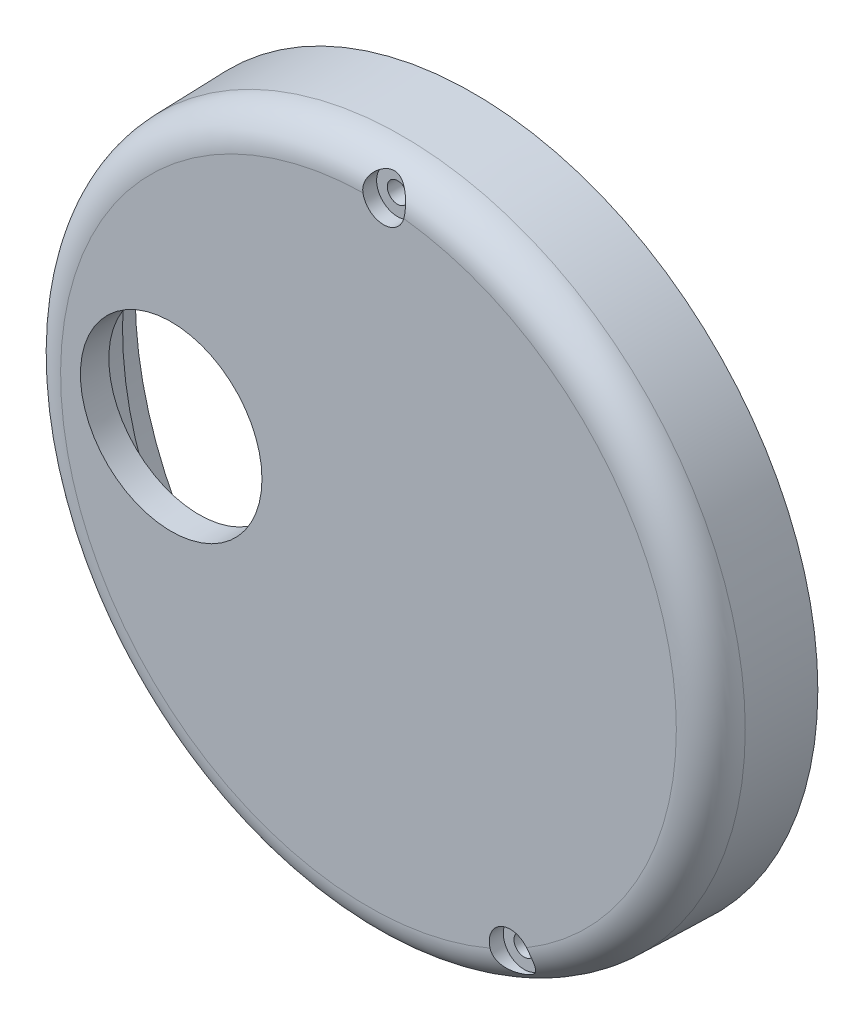
ISO-10303-21;
HEADER;
FILE_DESCRIPTION(('STEP AP214'),'2;1');
FILE_NAME('part.step','',(''),(''),'','','');
FILE_SCHEMA(('AUTOMOTIVE_DESIGN { 1 0 10303 214 1 1 1 1 }'));
ENDSEC;
DATA;
#1=APPLICATION_CONTEXT('core data for automotive mechanical design processes');
#2=APPLICATION_PROTOCOL_DEFINITION('international standard','automotive_design',2000,#1);
#3=PRODUCT_CONTEXT('',#1,'mechanical');
#4=PRODUCT('Part','Part','',(#3));
#5=PRODUCT_RELATED_PRODUCT_CATEGORY('part','',(#4));
#6=PRODUCT_DEFINITION_FORMATION('','',#4);
#7=PRODUCT_DEFINITION_CONTEXT('part definition',#1,'design');
#8=PRODUCT_DEFINITION('design','',#6,#7);
#9=PRODUCT_DEFINITION_SHAPE('','',#8);
#10=(LENGTH_UNIT() NAMED_UNIT(*) SI_UNIT(.MILLI.,.METRE.));
#11=(NAMED_UNIT(*) PLANE_ANGLE_UNIT() SI_UNIT($,.RADIAN.));
#12=(NAMED_UNIT(*) SI_UNIT($,.STERADIAN.) SOLID_ANGLE_UNIT());
#13=UNCERTAINTY_MEASURE_WITH_UNIT(LENGTH_MEASURE(1.E-05),#10,'distance_accuracy_value','');
#14=(GEOMETRIC_REPRESENTATION_CONTEXT(3) GLOBAL_UNCERTAINTY_ASSIGNED_CONTEXT((#13)) GLOBAL_UNIT_ASSIGNED_CONTEXT((#10,
#11,#12)) REPRESENTATION_CONTEXT('',''));
#15=CARTESIAN_POINT('',(0.,0.,0.));
#16=DIRECTION('',(0.,0.,1.));
#17=DIRECTION('',(1.,0.,0.));
#18=AXIS2_PLACEMENT_3D('',#15,#16,#17);
#19=CARTESIAN_POINT('',(-6.78741900755036,83.5812676985578,-125.795498858016));
#20=DIRECTION('',(0.,0.,1.));
#21=DIRECTION('',(1.,0.,0.));
#22=AXIS2_PLACEMENT_3D('',#19,#20,#21);
#23=CONICAL_SURFACE('',#22,1.50157783588853,0.0174532925199433);
#24=CARTESIAN_POINT('',(-6.78741900755036,83.5812676985578,-129.795498858016));
#25=DIRECTION('',(0.,0.,1.));
#26=DIRECTION('',(1.,0.,0.));
#27=AXIS2_PLACEMENT_3D('',#24,#25,#26);
#28=CIRCLE('',#27,1.43175757617566);
#29=CARTESIAN_POINT('',(-8.14134474266486,84.046901525434,-129.795498858016));
#30=VERTEX_POINT('',#29);
#31=CARTESIAN_POINT('',(-5.39481927823581,83.9138270930271,-129.795498858016));
#32=VERTEX_POINT('',#31);
#33=EDGE_CURVE('E219',#30,#32,#28,.T.);
#34=ORIENTED_EDGE('',*,*,#33,.F.);
#35=CARTESIAN_POINT('',(-7.94099813160655,84.2157445192783,-136.395698858016));
#36=CARTESIAN_POINT('',(-7.9556105030547,84.2047825599322,-135.964762017748));
#37=CARTESIAN_POINT('',(-7.96987417897829,84.1938057789213,-135.533813848621));
#38=CARTESIAN_POINT('',(-7.99776566614191,84.1718256568411,-134.671898598607));
#39=CARTESIAN_POINT('',(-8.0113934788587,84.1608223158336,-134.240931517766));
#40=CARTESIAN_POINT('',(-8.04854010919854,84.1301511570527,-133.04089545906));
#41=CARTESIAN_POINT('',(-8.0714317337458,84.110457643341,-132.271807731539));
#42=CARTESIAN_POINT('',(-8.11563331418185,84.0710078700088,-130.733585154515));
#43=CARTESIAN_POINT('',(-8.1369432635069,84.0512516101282,-129.964450304829));
#44=CARTESIAN_POINT('',(-8.15758577601917,84.0314701458117,-129.195298858016));
#45=B_SPLINE_CURVE_WITH_KNOTS('',3,(#35,#36,#37,#38,#39,#40,#41,#42,#43,#44),.UNSPECIFIED.,.F.,
.F.,(4,2,2,2,4),(0.,1.29397116866399,2.58793933200851,4.89697844326126,7.20602713618848),.UNSPECIFIED.);
#46=CARTESIAN_POINT('',(-7.96112787458682,84.2004677061741,-135.795498858016));
#47=VERTEX_POINT('',#46);
#48=EDGE_CURVE('E198',#47,#30,#45,.T.);
#49=ORIENTED_EDGE('',*,*,#48,.F.);
#50=CARTESIAN_POINT('',(-6.78741900755036,83.5812676985578,-135.795498858016));
#51=DIRECTION('',(0.,0.,1.));
#52=DIRECTION('',(1.,0.,0.));
#53=AXIS2_PLACEMENT_3D('',#50,#51,#52);
#54=CIRCLE('',#53,1.32702718660635);
#55=CARTESIAN_POINT('',(-5.55934567831581,84.0840967470575,-135.795498858016));
#56=VERTEX_POINT('',#55);
#57=EDGE_CURVE('E145',#56,#47,#54,.T.);
#58=ORIENTED_EDGE('',*,*,#57,.F.);
#59=CARTESIAN_POINT('',(-5.38014617849241,83.8968978642973,-129.195298858016));
#60=CARTESIAN_POINT('',(-5.39157889919243,83.9102094155509,-129.66747237699));
#61=CARTESIAN_POINT('',(-5.40326926331563,83.9235361274661,-130.139639232242));
#62=CARTESIAN_POINT('',(-5.42721283177428,83.950222095674,-131.083956633028));
#63=CARTESIAN_POINT('',(-5.43946603478898,83.9635813518902,-131.556107178598));
#64=CARTESIAN_POINT('',(-5.47138721339197,83.9975823560975,-132.756204138173));
#65=CARTESIAN_POINT('',(-5.49147553929976,84.0182480877535,-133.484138793648));
#66=CARTESIAN_POINT('',(-5.53335244165465,84.059674186037,-134.939959051388));
#67=CARTESIAN_POINT('',(-5.55514102426952,84.0804345530076,-135.667844653463));
#68=CARTESIAN_POINT('',(-5.57790421527628,84.1012480816109,-136.395698858016));
#69=B_SPLINE_CURVE_WITH_KNOTS('',3,(#59,#60,#61,#62,#63,#64,#65,#66,#67,#68),.UNSPECIFIED.,.F.,
.F.,(4,2,2,2,4),(0.,1.41749827157877,2.8349932170927,5.02050615327659,7.20602701791064),.UNSPECIFIED.);
#70=EDGE_CURVE('E205',#32,#56,#69,.T.);
#71=ORIENTED_EDGE('',*,*,#70,.F.);
#72=EDGE_LOOP('',(#34,#49,#58,#71));
#73=FACE_BOUND('',#72,.T.);
#74=CARTESIAN_POINT('',(-6.78741900755036,83.5812676985578,-127.795498858016));
#75=DIRECTION('',(0.,0.,1.));
#76=DIRECTION('',(1.,0.,0.));
#77=AXIS2_PLACEMENT_3D('',#74,#75,#76);
#78=CIRCLE('',#77,1.4666677060321);
#79=CARTESIAN_POINT('',(-5.32075130151827,83.5812676985578,-127.795498858016));
#80=VERTEX_POINT('',#79);
#81=EDGE_CURVE('E141',#80,#80,#78,.F.);
#82=ORIENTED_EDGE('',*,*,#81,.F.);
#83=EDGE_LOOP('',(#82));
#84=FACE_BOUND('',#83,.T.);
#85=ADVANCED_FACE('F39',(#73,#84),#23,.F.);
#86=CARTESIAN_POINT('',(11.3518120625595,-0.720065292669134,-125.795498858016));
#87=DIRECTION('',(0.,0.,1.));
#88=DIRECTION('',(1.,0.,0.));
#89=AXIS2_PLACEMENT_3D('',#86,#87,#88);
#90=CONICAL_SURFACE('',#89,1.50027209147973,0.0174532925199433);
#91=CARTESIAN_POINT('',(11.3518120625595,-0.720065292669134,-129.795498858016));
#92=DIRECTION('',(0.,0.,1.));
#93=DIRECTION('',(1.,0.,0.));
#94=AXIS2_PLACEMENT_3D('',#91,#92,#93);
#95=CIRCLE('',#94,1.43045183176685);
#96=CARTESIAN_POINT('',(12.7652701455591,-0.500227419207196,-129.795498858016));
#97=VERTEX_POINT('',#96);
#98=CARTESIAN_POINT('',(10.3458700765037,-1.73705750684554,-129.795498858016));
#99=VERTEX_POINT('',#98);
#100=EDGE_CURVE('E182',#97,#99,#95,.T.);
#101=ORIENTED_EDGE('',*,*,#100,.F.);
#102=CARTESIAN_POINT('',(12.6666901519423,-0.751126348698803,-136.395698858016));
#103=CARTESIAN_POINT('',(12.6746096019755,-0.733986819852993,-135.965216406575));
#104=CARTESIAN_POINT('',(12.6821863717673,-0.717024739088915,-135.534720735951));
#105=CARTESIAN_POINT('',(12.6967191765143,-0.683422575864055,-134.673707522787));
#106=CARTESIAN_POINT('',(12.703675213184,-0.666782492513925,-134.243189980309));
#107=CARTESIAN_POINT('',(12.7222891673146,-0.62080348537237,-133.043158133573));
#108=CARTESIAN_POINT('',(12.7333369047218,-0.591781692495119,-132.273622229966));
#109=CARTESIAN_POINT('',(12.7539112119055,-0.534531163927611,-130.734496672024));
#110=CARTESIAN_POINT('',(12.763437774161,-0.506302432159013,-129.964907017443));
#111=CARTESIAN_POINT('',(12.7723313254267,-0.478405268088037,-129.195298858016));
#112=B_SPLINE_CURVE_WITH_KNOTS('',3,(#102,#103,#104,#105,#106,#107,#108,#109,#110,#111),
.UNSPECIFIED.,.F.,.F.,(4,2,2,2,4),(0.,1.2926885022884,2.58537343369553,4.89585787492987,
7.20635373941659),.UNSPECIFIED.);
#113=CARTESIAN_POINT('',(12.6775135292315,-0.727342899810947,-135.795498858016));
#114=VERTEX_POINT('',#113);
#115=EDGE_CURVE('E174',#114,#97,#112,.T.);
#116=ORIENTED_EDGE('',*,*,#115,.F.);
#117=CARTESIAN_POINT('',(11.3518120625595,-0.720065292669134,-135.795498858016));
#118=DIRECTION('',(0.,0.,1.));
#119=DIRECTION('',(1.,0.,0.));
#120=AXIS2_PLACEMENT_3D('',#117,#118,#119);
#121=CIRCLE('',#120,1.32572144219755);
#122=CARTESIAN_POINT('',(10.5813589630717,-1.79892550779991,-135.795498858016));
#123=VERTEX_POINT('',#122);
#124=EDGE_CURVE('E226',#123,#114,#121,.T.);
#125=ORIENTED_EDGE('',*,*,#124,.F.);
#126=CARTESIAN_POINT('',(10.324046151039,-1.73000181283951,-129.195298858016));
#127=CARTESIAN_POINT('',(10.3410925352053,-1.73560024063044,-129.667029611876));
#128=CARTESIAN_POINT('',(10.3583861169319,-1.74107527386515,-130.138752899448));
#129=CARTESIAN_POINT('',(10.393515918187,-1.75175378154789,-131.082181019959));
#130=CARTESIAN_POINT('',(10.4113521362098,-1.75695725674939,-131.553885852947));
#131=CARTESIAN_POINT('',(10.4574833951981,-1.76981917893573,-132.753987605024));
#132=CARTESIAN_POINT('',(10.4861875830524,-1.77727249180005,-133.482371121523));
#133=CARTESIAN_POINT('',(10.5452650340357,-1.79133941544066,-134.939081584575));
#134=CARTESIAN_POINT('',(10.5756383043386,-1.79795302260735,-135.667408530871));
#135=CARTESIAN_POINT('',(10.6069758976299,-1.80408017566371,-136.395698858016));
#136=B_SPLINE_CURVE_WITH_KNOTS('',3,(#126,#127,#128,#129,#130,#131,#132,#133,#134,#135),
.UNSPECIFIED.,.F.,.F.,(4,2,2,2,4),(0.,1.41621541563659,2.8324269016299,5.01938554090126,
7.20635358086466),.UNSPECIFIED.);
#137=EDGE_CURVE('E166',#99,#123,#136,.T.);
#138=ORIENTED_EDGE('',*,*,#137,.F.);
#139=EDGE_LOOP('',(#101,#116,#125,#138));
#140=FACE_BOUND('',#139,.T.);
#141=CARTESIAN_POINT('',(11.3518120625595,-0.720065292669134,-127.795498858016));
#142=DIRECTION('',(0.,0.,1.));
#143=DIRECTION('',(1.,0.,0.));
#144=AXIS2_PLACEMENT_3D('',#141,#142,#143);
#145=CIRCLE('',#144,1.46536196162329);
#146=CARTESIAN_POINT('',(12.8171740241828,-0.720065292669134,-127.795498858016));
#147=VERTEX_POINT('',#146);
#148=EDGE_CURVE('E137',#147,#147,#145,.F.);
#149=ORIENTED_EDGE('',*,*,#148,.F.);
#150=EDGE_LOOP('',(#149));
#151=FACE_BOUND('',#150,.T.);
#152=ADVANCED_FACE('F156',(#140,#151),#90,.F.);
#153=CARTESIAN_POINT('',(-8.948,38.989,-134.900206651247));
#154=DIRECTION('',(0.,0.,-1.));
#155=DIRECTION('',(1.,0.,0.));
#156=AXIS2_PLACEMENT_3D('',#153,#154,#155);
#157=CONICAL_SURFACE('',#156,45.1987930530222,0.026179938779915);
#158=CARTESIAN_POINT('',(-8.948,38.989,-129.795498858016));
#159=DIRECTION('',(0.,0.,1.));
#160=DIRECTION('',(1.,0.,0.));
#161=AXIS2_PLACEMENT_3D('',#158,#159,#160);
#162=CIRCLE('',#161,45.065121575115);
#163=EDGE_CURVE('E118',#30,#99,#162,.T.);
#164=ORIENTED_EDGE('',*,*,#163,.T.);
#165=ORIENTED_EDGE('',*,*,#137,.T.);
#166=CARTESIAN_POINT('',(-8.948,38.989,-135.795498858016));
#167=DIRECTION('',(0.,0.,-1.));
#168=DIRECTION('',(-1.,0.,0.));
#169=AXIS2_PLACEMENT_3D('',#166,#167,#168);
#170=CIRCLE('',#169,45.2222371045301);
#171=EDGE_CURVE('E131',#47,#123,#170,.F.);
#172=ORIENTED_EDGE('',*,*,#171,.F.);
#173=ORIENTED_EDGE('',*,*,#48,.T.);
#174=EDGE_LOOP('',(#164,#165,#172,#173));
#175=FACE_BOUND('',#174,.T.);
#176=ADVANCED_FACE('F160',(#175),#157,.F.);
#177=EDGE_CURVE('E135',#114,#56,#170,.F.);
#178=ORIENTED_EDGE('',*,*,#177,.F.);
#179=ORIENTED_EDGE('',*,*,#115,.T.);
#180=EDGE_CURVE('E129',#97,#32,#162,.T.);
#181=ORIENTED_EDGE('',*,*,#180,.T.);
#182=ORIENTED_EDGE('',*,*,#70,.T.);
#183=EDGE_LOOP('',(#178,#179,#181,#182));
#184=FACE_BOUND('',#183,.T.);
#185=ADVANCED_FACE('F184',(#184),#157,.F.);
#186=CARTESIAN_POINT('',(-8.948,38.989,-134.795498858016));
#187=DIRECTION('',(0.,0.,-1.));
#188=DIRECTION('',(1.,0.,0.));
#189=AXIS2_PLACEMENT_3D('',#186,#187,#188);
#190=CONICAL_SURFACE('',#189,49.1974223529244,0.026179938779915);
#191=CARTESIAN_POINT('',(-8.948,38.989,-130.664614116476));
#192=DIRECTION('',(0.,0.,1.));
#193=DIRECTION('',(1.,0.,0.));
#194=AXIS2_PLACEMENT_3D('',#191,#192,#193);
#195=CIRCLE('',#194,49.0892513290711);
#196=CARTESIAN_POINT('',(40.1412513290711,38.989,-130.664614116476));
#197=VERTEX_POINT('',#196);
#198=EDGE_CURVE('E101',#197,#197,#195,.F.);
#199=ORIENTED_EDGE('',*,*,#198,.T.);
#200=EDGE_LOOP('',(#199));
#201=FACE_BOUND('',#200,.T.);
#202=CARTESIAN_POINT('',(-8.948,38.989,-140.795498858016));
#203=DIRECTION('',(0.,0.,1.));
#204=DIRECTION('',(1.,0.,0.));
#205=AXIS2_PLACEMENT_3D('',#202,#203,#204);
#206=CIRCLE('',#205,49.3545378823395);
#207=CARTESIAN_POINT('',(40.4065378823395,38.989,-140.795498858016));
#208=VERTEX_POINT('',#207);
#209=EDGE_CURVE('E113',#208,#208,#206,.T.);
#210=ORIENTED_EDGE('',*,*,#209,.T.);
#211=EDGE_LOOP('',(#210));
#212=FACE_BOUND('',#211,.T.);
#213=ADVANCED_FACE('F189',(#201,#212),#190,.T.);
#214=CARTESIAN_POINT('',(-8.948,38.989,-140.795498858016));
#215=DIRECTION('',(0.,0.,1.));
#216=DIRECTION('',(1.,0.,0.));
#217=AXIS2_PLACEMENT_3D('',#214,#215,#216);
#218=PLANE('',#217);
#219=CARTESIAN_POINT('',(-8.948,38.989,-140.795498858016));
#220=DIRECTION('',(0.,0.,-1.));
#221=DIRECTION('',(-1.,0.,0.));
#222=AXIS2_PLACEMENT_3D('',#219,#220,#221);
#223=CIRCLE('',#222,48.4045378823395);
#224=CARTESIAN_POINT('',(-57.3525378823395,38.989,-140.795498858016));
#225=VERTEX_POINT('',#224);
#226=EDGE_CURVE('E265',#225,#225,#223,.T.);
#227=ORIENTED_EDGE('',*,*,#226,.F.);
#228=EDGE_LOOP('',(#227));
#229=FACE_BOUND('',#228,.T.);
#230=ORIENTED_EDGE('',*,*,#209,.F.);
#231=EDGE_LOOP('',(#230));
#232=FACE_BOUND('',#231,.T.);
#233=ADVANCED_FACE('F309',(#229,#232),#218,.F.);
#234=CARTESIAN_POINT('',(-8.948,38.989,-125.795498858016));
#235=DIRECTION('',(0.,0.,1.));
#236=DIRECTION('',(1.,0.,0.));
#237=AXIS2_PLACEMENT_3D('',#234,#235,#236);
#238=PLANE('',#237);
#239=CARTESIAN_POINT('',(-6.78741900755036,83.5812676985578,-125.795498858016));
#240=DIRECTION('',(0.,0.,1.));
#241=DIRECTION('',(1.,0.,0.));
#242=AXIS2_PLACEMENT_3D('',#239,#240,#241);
#243=CIRCLE('',#242,3.);
#244=CARTESIAN_POINT('',(-9.7440114416528,83.0727785849986,-125.795498858016));
#245=VERTEX_POINT('',#244);
#246=CARTESIAN_POINT('',(-3.89383492874533,82.7893262999139,-125.795498858016));
#247=VERTEX_POINT('',#246);
#248=EDGE_CURVE('E58',#245,#247,#243,.T.);
#249=ORIENTED_EDGE('',*,*,#248,.F.);
#250=CARTESIAN_POINT('',(-8.948,38.989,-125.795498858016));
#251=DIRECTION('',(0.,0.,1.));
#252=DIRECTION('',(1.,0.,0.));
#253=AXIS2_PLACEMENT_3D('',#250,#251,#252);
#254=CIRCLE('',#253,44.0909647041933);
#255=CARTESIAN_POINT('',(8.46036875990934,-1.51978751166754,-125.795498858016));
#256=VERTEX_POINT('',#255);
#257=EDGE_CURVE('E107',#245,#256,#254,.T.);
#258=ORIENTED_EDGE('',*,*,#257,.T.);
#259=CARTESIAN_POINT('',(11.3518120625595,-0.720065292669134,-125.795498858016));
#260=DIRECTION('',(0.,0.,1.));
#261=DIRECTION('',(1.,0.,0.));
#262=AXIS2_PLACEMENT_3D('',#259,#260,#261);
#263=CIRCLE('',#262,3.);
#264=CARTESIAN_POINT('',(13.693333691515,1.15537504526048,-125.795498858016));
#265=VERTEX_POINT('',#264);
#266=EDGE_CURVE('E65',#265,#256,#263,.T.);
#267=ORIENTED_EDGE('',*,*,#266,.F.);
#268=EDGE_CURVE('E106',#265,#247,#254,.T.);
#269=ORIENTED_EDGE('',*,*,#268,.T.);
#270=EDGE_LOOP('',(#249,#258,#267,#269));
#271=FACE_BOUND('',#270,.T.);
#272=CARTESIAN_POINT('',(-37.2018029999569,40.3355571486306,-125.795498858016));
#273=DIRECTION('',(0.,0.,1.));
#274=DIRECTION('',(1.,0.,0.));
#275=AXIS2_PLACEMENT_3D('',#272,#273,#274);
#276=CIRCLE('',#275,13.);
#277=CARTESIAN_POINT('',(-24.2018029999569,40.3355571486306,-125.795498858016));
#278=VERTEX_POINT('',#277);
#279=EDGE_CURVE('E130',#278,#278,#276,.T.);
#280=ORIENTED_EDGE('',*,*,#279,.F.);
#281=EDGE_LOOP('',(#280));
#282=FACE_BOUND('',#281,.T.);
#283=ADVANCED_FACE('F104',(#271,#282),#238,.T.);
#284=CARTESIAN_POINT('',(-8.948,38.989,-129.795498858016));
#285=DIRECTION('',(0.,0.,1.));
#286=DIRECTION('',(1.,0.,0.));
#287=AXIS2_PLACEMENT_3D('',#284,#285,#286);
#288=PLANE('',#287);
#289=CARTESIAN_POINT('',(-37.2018029999569,40.3355571486306,-129.795498858016));
#290=DIRECTION('',(0.,0.,1.));
#291=DIRECTION('',(1.,0.,0.));
#292=AXIS2_PLACEMENT_3D('',#289,#290,#291);
#293=CIRCLE('',#292,12.9301797402871);
#294=CARTESIAN_POINT('',(-24.2716232596698,40.3355571486306,-129.795498858016));
#295=VERTEX_POINT('',#294);
#296=EDGE_CURVE('E125',#295,#295,#293,.T.);
#297=ORIENTED_EDGE('',*,*,#296,.T.);
#298=EDGE_LOOP('',(#297));
#299=FACE_BOUND('',#298,.T.);
#300=ORIENTED_EDGE('',*,*,#180,.F.);
#301=ORIENTED_EDGE('',*,*,#100,.T.);
#302=ORIENTED_EDGE('',*,*,#163,.F.);
#303=ORIENTED_EDGE('',*,*,#33,.T.);
#304=EDGE_LOOP('',(#300,#301,#302,#303));
#305=FACE_BOUND('',#304,.T.);
#306=ADVANCED_FACE('F193',(#299,#305),#288,.F.);
#307=CARTESIAN_POINT('',(-8.948,38.989,-130.795498858016));
#308=DIRECTION('',(0.,0.,1.));
#309=DIRECTION('',(1.,0.,0.));
#310=AXIS2_PLACEMENT_3D('',#307,#308,#309);
#311=TOROIDAL_SURFACE('',#310,44.0909647041933,5.);
#312=CARTESIAN_POINT('',(-8.75276076060586,81.3146773531864,-126.117320775795));
#313=CARTESIAN_POINT('',(-8.63031980793035,81.2085056499256,-126.157160108245));
#314=CARTESIAN_POINT('',(-8.49931921624957,81.1122750438139,-126.197130011905));
#315=CARTESIAN_POINT('',(-8.22232407128328,80.9416777107072,-126.272012834737));
#316=CARTESIAN_POINT('',(-8.07633395937927,80.8673045324576,-126.306927244499));
#317=CARTESIAN_POINT('',(-7.84797869049029,80.7737664751172,-126.351540339903));
#318=CARTESIAN_POINT('',(-7.76999395496511,80.7455204194037,-126.365153910257));
#319=CARTESIAN_POINT('',(-7.61150901556947,80.6954800658345,-126.389120733192));
#320=CARTESIAN_POINT('',(-7.53101007211275,80.6736825908224,-126.399475591472));
#321=CARTESIAN_POINT('',(-7.36815719330202,80.6368316129672,-126.416401721109));
#322=CARTESIAN_POINT('',(-7.28580489271607,80.6217723939528,-126.422976200778));
#323=CARTESIAN_POINT('',(-7.11993516915508,80.5985747037299,-126.43201945991));
#324=CARTESIAN_POINT('',(-7.03641787983223,80.5904354451659,-126.434488706497));
#325=CARTESIAN_POINT('',(-6.80179617188871,80.5775120835235,-126.43540700831));
#326=CARTESIAN_POINT('',(-6.65013624577341,80.5806368752062,-126.429051979786));
#327=CARTESIAN_POINT('',(-6.35016428445908,80.6094696408344,-126.403498717417));
#328=CARTESIAN_POINT('',(-6.20185381645638,80.635187970494,-126.384294595173));
#329=CARTESIAN_POINT('',(-5.91478977574823,80.7072378638256,-126.336556469242));
#330=CARTESIAN_POINT('',(-5.7759151346893,80.7532045283991,-126.30818989569));
#331=CARTESIAN_POINT('',(-5.5073715954304,80.8641714726386,-126.245756000267));
#332=CARTESIAN_POINT('',(-5.3777068536955,80.9291802791347,-126.211686127466));
#333=CARTESIAN_POINT('',(-5.11230077543181,81.0870728646205,-126.13684392847));
#334=CARTESIAN_POINT('',(-4.97818582913894,81.1825638971511,-126.095795093141));
#335=CARTESIAN_POINT('',(-4.72671798469898,81.3948205494429,-126.016622747915));
#336=CARTESIAN_POINT('',(-4.60937344330236,81.5115967101673,-125.978500700795));
#337=CARTESIAN_POINT('',(-4.44577373211716,81.7039675798163,-125.926492056557));
#338=CARTESIAN_POINT('',(-4.3922571335599,81.7727238130095,-125.909703856109));
#339=CARTESIAN_POINT('',(-4.29115719250985,81.9150491024459,-125.878964146505));
#340=CARTESIAN_POINT('',(-4.24357108637711,81.9886158923913,-125.865011314126));
#341=CARTESIAN_POINT('',(-4.15483803183292,82.1400137908292,-125.840550205999));
#342=CARTESIAN_POINT('',(-4.1136867550657,82.2178419849196,-125.830039609595));
#343=CARTESIAN_POINT('',(-4.03825168780152,82.3771731628667,-125.812965938504));
#344=CARTESIAN_POINT('',(-4.00396684674771,82.45867558223,-125.806402259635));
#345=CARTESIAN_POINT('',(-3.94599399813237,82.6155953949481,-125.79809943675));
#346=CARTESIAN_POINT('',(-3.92156011189081,82.6907145302098,-125.795914388434));
#347=CARTESIAN_POINT('',(-3.87868340181457,82.8426927734301,-125.795190920803));
#348=CARTESIAN_POINT('',(-3.86024264239004,82.9195524712167,-125.796653756548));
#349=CARTESIAN_POINT('',(-3.82951839966275,83.0742789302649,-125.803323196756));
#350=CARTESIAN_POINT('',(-3.81723046546585,83.1521449216332,-125.808527088319));
#351=CARTESIAN_POINT('',(-3.7988295178796,83.3082762563321,-125.822661275552));
#352=CARTESIAN_POINT('',(-3.79271878876918,83.3865417366456,-125.831592948));
#353=CARTESIAN_POINT('',(-3.78409351878683,83.6087169100114,-125.862169141462));
#354=CARTESIAN_POINT('',(-3.78894335400508,83.7523920923478,-125.88818495892));
#355=CARTESIAN_POINT('',(-3.81852986419787,84.0350892275465,-125.951198829412));
#356=CARTESIAN_POINT('',(-3.84327091760041,84.1741101489007,-125.988199299241));
#357=CARTESIAN_POINT('',(-3.91306759367751,84.4530532878712,-126.073704405912));
#358=CARTESIAN_POINT('',(-3.95927053804653,84.5925130071663,-126.122773196765));
#359=CARTESIAN_POINT('',(-4.07011001059633,84.8608522624281,-126.22825925018));
#360=CARTESIAN_POINT('',(-4.13475164257439,84.9897288562657,-126.284678544996));
#361=CARTESIAN_POINT('',(-4.29160410959151,85.2539745572239,-126.410838179592));
#362=CARTESIAN_POINT('',(-4.38650041200753,85.3873999018516,-126.481305221496));
#363=CARTESIAN_POINT('',(-4.59640213225321,85.6370170053333,-126.623732419426));
#364=CARTESIAN_POINT('',(-4.7114471037524,85.7531740199018,-126.695695262304));
#365=CARTESIAN_POINT('',(-4.90562906890482,85.9194943894454,-126.804912281099));
#366=CARTESIAN_POINT('',(-4.97840411337265,85.9762684871841,-126.843554933173));
#367=CARTESIAN_POINT('',(-5.12968585023482,86.0833740111738,-126.918460103477));
#368=CARTESIAN_POINT('',(-5.20819406079486,86.1337037211391,-126.954721986407));
#369=CARTESIAN_POINT('',(-5.45172263287353,86.2740011441113,-127.057847080395));
#370=CARTESIAN_POINT('',(-5.62535800065966,86.3538073771496,-127.1194138798));
#371=CARTESIAN_POINT('',(-5.92621355327448,86.4577152328394,-127.198884430697));
#372=CARTESIAN_POINT('',(-6.04809027344814,86.4915351285804,-127.224529608301));
#373=CARTESIAN_POINT('',(-6.29716040394496,86.5436585400764,-127.261684988514));
#374=CARTESIAN_POINT('',(-6.42434523192724,86.5619861566405,-127.273217158809));
#375=CARTESIAN_POINT('',(-6.68084735037141,86.5821404408579,-127.280514895117));
#376=CARTESIAN_POINT('',(-6.81016969132093,86.5839198607921,-127.276235364802));
#377=CARTESIAN_POINT('',(-7.06661334457987,86.571013159906,-127.252466963088));
#378=CARTESIAN_POINT('',(-7.19373226474091,86.5563101585361,-127.232962505226));
#379=CARTESIAN_POINT('',(-7.4668060068721,86.5072307454999,-127.176295168934));
#380=CARTESIAN_POINT('',(-7.61159637647939,86.4695753982521,-127.136429328168));
#381=CARTESIAN_POINT('',(-7.89058830326682,86.3749785811289,-127.044361485116));
#382=CARTESIAN_POINT('',(-8.02476880073512,86.3179998851305,-126.992135730777));
#383=CARTESIAN_POINT('',(-8.31524125456704,86.1695035132733,-126.865805773242));
#384=CARTESIAN_POINT('',(-8.46796779947956,86.0728341488075,-126.789571586046));
#385=CARTESIAN_POINT('',(-8.75291807080084,85.8548177287287,-126.634089290665));
#386=CARTESIAN_POINT('',(-8.88512543059573,85.7334511505038,-126.55483883873));
#387=CARTESIAN_POINT('',(-9.12778777866427,85.4668423040325,-126.39937748489));
#388=CARTESIAN_POINT('',(-9.23807082636047,85.321426531014,-126.323194080106));
#389=CARTESIAN_POINT('',(-9.43194496963816,85.0095728080917,-126.180718959137));
#390=CARTESIAN_POINT('',(-9.51558068888051,84.8431706614181,-126.114410806093));
#391=CARTESIAN_POINT('',(-9.63720619745392,84.530264060246,-126.009840436259));
#392=CARTESIAN_POINT('',(-9.68111991799889,84.387049706776,-125.968612697342));
#393=CARTESIAN_POINT('',(-9.7473164116185,84.0928265097897,-125.898317739598));
#394=CARTESIAN_POINT('',(-9.76961396162051,83.9418230654138,-125.869242221195));
#395=CARTESIAN_POINT('',(-9.79086715316023,83.6355339145474,-125.824946114797));
#396=CARTESIAN_POINT('',(-9.78973325722056,83.4802340471963,-125.809778904466));
#397=CARTESIAN_POINT('',(-9.76327612129733,83.1709627608235,-125.794066744837));
#398=CARTESIAN_POINT('',(-9.73795537043342,83.0169912067476,-125.793520291055));
#399=CARTESIAN_POINT('',(-9.66629730109831,82.7249747863032,-125.805677902502));
#400=CARTESIAN_POINT('',(-9.62138946803795,82.5865383673854,-125.817546662524));
#401=CARTESIAN_POINT('',(-9.5126226440444,82.3186571410054,-125.851370268059));
#402=CARTESIAN_POINT('',(-9.44875682881106,82.1892155921665,-125.873328747128));
#403=CARTESIAN_POINT('',(-9.29313626867471,81.9234013570206,-125.928600675385));
#404=CARTESIAN_POINT('',(-9.19863892876332,81.7888877476715,-125.963121251218));
#405=CARTESIAN_POINT('',(-8.98989928317068,81.537794347326,-126.037488028741));
#406=CARTESIAN_POINT('',(-8.8756405765605,81.4212296060984,-126.07733864782));
#407=CARTESIAN_POINT('',(-8.75276076060586,81.3146773531864,-126.117320775795));
#408=B_SPLINE_CURVE_WITH_KNOTS('',3,(#312,#313,#314,#315,#316,#317,#318,#319,#320,#321,#322,
#323,#324,#325,#326,#327,#328,#329,#330,#331,#332,#333,#334,#335,#336,#337,#338,#339,#340,#341,
#342,#343,#344,#345,#346,#347,#348,#349,#350,#351,#352,#353,#354,#355,#356,#357,#358,#359,#360,
#361,#362,#363,#364,#365,#366,#367,#368,#369,#370,#371,#372,#373,#374,#375,#376,#377,#378,#379,
#380,#381,#382,#383,#384,#385,#386,#387,#388,#389,#390,#391,#392,#393,#394,#395,#396,#397,#398,
#399,#400,#401,#402,#403,#404,#405,#406,#407),.UNSPECIFIED.,.T.,.F.,(4,2,2,2,2,2,2,2,2,2,2,2,2,
2,2,2,2,2,2,2,2,2,2,2,2,2,2,2,2,2,2,2,2,2,2,2,2,2,2,2,2,2,2,2,2,2,2,4),(0.,0.50016040093364,
1.0001730301273,1.25204093546166,1.50378454033819,1.75531418028009,2.00681519726208,
2.45975715772404,2.9129068318285,3.35820452214997,3.80370191676555,4.3106123086655,
4.81777442155675,5.08365661445477,5.34941443786854,5.61499272443502,5.88053034673278,
6.11727966062112,6.35411043965248,6.59076964918804,6.82751634134705,7.26367361491145,
7.69992692111771,8.16279658306621,8.62579449108257,9.15849936176482,9.69226194825961,
9.9920806327279,10.2919790003239,10.8891509120824,11.2748057880839,11.6598596040218,
12.0460124731497,12.4325611841577,12.894534103584,13.3574021103865,13.9429501858034,
14.5289629349493,15.1194043742785,15.708851798252,16.1729922080694,16.6368151048652,
17.1024107128028,17.567958410488,18.0040815485714,18.4403618685657,18.9418967233887,
19.4438498417821),.UNSPECIFIED.);
#409=EDGE_CURVE('E11',#247,#245,#408,.T.);
#410=ORIENTED_EDGE('',*,*,#409,.F.);
#411=ORIENTED_EDGE('',*,*,#268,.F.);
#412=CARTESIAN_POINT('',(9.41826200537558,-3.01383602584765,-126.112418145034));
#413=CARTESIAN_POINT('',(9.55697935175836,-3.13076388449581,-126.173289274575));
#414=CARTESIAN_POINT('',(9.70476159771477,-3.23378717103675,-126.240538238824));
#415=CARTESIAN_POINT('',(10.0137696916007,-3.41107408534307,-126.382343494395));
#416=CARTESIAN_POINT('',(10.1750284036394,-3.48526475810889,-126.456917731809));
#417=CARTESIAN_POINT('',(10.507011522317,-3.60404253428069,-126.60721963539));
#418=CARTESIAN_POINT('',(10.6777104323073,-3.64870552602992,-126.682943829053));
#419=CARTESIAN_POINT('',(11.0264426204302,-3.7075942359793,-126.828998125044));
#420=CARTESIAN_POINT('',(11.2044653300266,-3.72186234630975,-126.899335608025));
#421=CARTESIAN_POINT('',(11.5216100834819,-3.71838299715914,-127.010902624268));
#422=CARTESIAN_POINT('',(11.6597761751435,-3.70751790446937,-127.055062792053));
#423=CARTESIAN_POINT('',(11.9366305248292,-3.66581919748562,-127.130874591352));
#424=CARTESIAN_POINT('',(12.0753177699893,-3.63501380254046,-127.162543798197));
#425=CARTESIAN_POINT('',(12.2815015599862,-3.57329604916733,-127.197515306663));
#426=CARTESIAN_POINT('',(12.3502872053012,-3.54997011824736,-127.207100897833));
#427=CARTESIAN_POINT('',(12.4863951904002,-3.49819598995426,-127.221578994946));
#428=CARTESIAN_POINT('',(12.5537182585398,-3.46975041086013,-127.226473891738));
#429=CARTESIAN_POINT('',(12.6862307368072,-3.40793993536471,-127.231335989752));
#430=CARTESIAN_POINT('',(12.7514207411691,-3.37457642351926,-127.231304575252));
#431=CARTESIAN_POINT('',(12.8790265951303,-3.30327369319332,-127.226331376424));
#432=CARTESIAN_POINT('',(12.941442640409,-3.26533479817088,-127.221389939034));
#433=CARTESIAN_POINT('',(13.1068848236411,-3.15633028997341,-127.201522420968));
#434=CARTESIAN_POINT('',(13.2066896403631,-3.08112645312335,-127.181963013948));
#435=CARTESIAN_POINT('',(13.3945054830071,-2.92068588816569,-127.131238651163));
#436=CARTESIAN_POINT('',(13.4825048882691,-2.8354394273495,-127.100062372688));
#437=CARTESIAN_POINT('',(13.6777682073203,-2.62221355129087,-127.015341571714));
#438=CARTESIAN_POINT('',(13.7792289892002,-2.49050142989976,-126.957812698366));
#439=CARTESIAN_POINT('',(13.9577903268242,-2.21535007084031,-126.833738007571));
#440=CARTESIAN_POINT('',(14.0348536170301,-2.07189331061939,-126.767178616002));
#441=CARTESIAN_POINT('',(14.1657471172047,-1.77307739517691,-126.62992075494));
#442=CARTESIAN_POINT('',(14.2191418646583,-1.61755248646893,-126.559169869718));
#443=CARTESIAN_POINT('',(14.3000325421895,-1.29884870866926,-126.419791442973));
#444=CARTESIAN_POINT('',(14.3275258359409,-1.13566906223001,-126.351164118281));
#445=CARTESIAN_POINT('',(14.349052314517,-0.878304268968645,-126.249856545242));
#446=CARTESIAN_POINT('',(14.3525357664339,-0.78577169790384,-126.214783451831));
#447=CARTESIAN_POINT('',(14.350840005253,-0.599767794100988,-126.147495517585));
#448=CARTESIAN_POINT('',(14.3456651185612,-0.506296953393917,-126.115279257716));
#449=CARTESIAN_POINT('',(14.3263891021765,-0.319144926764511,-126.054454326211));
#450=CARTESIAN_POINT('',(14.3122924258752,-0.225463869007651,-126.025843863248));
#451=CARTESIAN_POINT('',(14.2749635324269,-0.0387090409508013,-125.972917044328));
#452=CARTESIAN_POINT('',(14.2517333707318,0.0543648611993757,-125.948599724001));
#453=CARTESIAN_POINT('',(14.1995788193775,0.227198652368046,-125.907657811067));
#454=CARTESIAN_POINT('',(14.1717489296859,0.307151206383722,-125.89044889594));
#455=CARTESIAN_POINT('',(14.1091067312089,0.465067275911736,-125.860129311436));
#456=CARTESIAN_POINT('',(14.0742957040134,0.543031153546361,-125.847017890973));
#457=CARTESIAN_POINT('',(13.9978892610771,0.696120726984052,-125.825151134203));
#458=CARTESIAN_POINT('',(13.9562998582655,0.771248866209678,-125.816391964752));
#459=CARTESIAN_POINT('',(13.8666529672529,0.917913384595101,-125.803331919428));
#460=CARTESIAN_POINT('',(13.8185962360344,0.989450182767703,-125.799030522299));
#461=CARTESIAN_POINT('',(13.6795870748338,1.17818775177392,-125.793401948184));
#462=CARTESIAN_POINT('',(13.5826477893092,1.29121366296709,-125.796440975004));
#463=CARTESIAN_POINT('',(13.373773099459,1.50111599256576,-125.814680314075));
#464=CARTESIAN_POINT('',(13.2618372146933,1.59799189335667,-125.829881016023));
#465=CARTESIAN_POINT('',(13.0261233299825,1.77358537190706,-125.870282053093));
#466=CARTESIAN_POINT('',(12.9023389306628,1.85229305784517,-125.895487815331));
#467=CARTESIAN_POINT('',(12.6459883218635,1.99034685511838,-125.953045914107));
#468=CARTESIAN_POINT('',(12.5134189794362,2.04968601392254,-125.985400809925));
#469=CARTESIAN_POINT('',(12.2268035908516,2.15398787830614,-126.057862254992));
#470=CARTESIAN_POINT('',(12.0720159680073,2.19659316534492,-126.098431182182));
#471=CARTESIAN_POINT('',(11.7575046910472,2.25669266544495,-126.179583280175));
#472=CARTESIAN_POINT('',(11.5977761930176,2.27416138335419,-126.220166423738));
#473=CARTESIAN_POINT('',(11.2627423149209,2.283671216869,-126.299310666498));
#474=CARTESIAN_POINT('',(11.0872529322866,2.27345969725849,-126.337417596658));
#475=CARTESIAN_POINT('',(10.7385993202105,2.22185551959364,-126.400639099149));
#476=CARTESIAN_POINT('',(10.5654318009878,2.18051311039888,-126.425774498957));
#477=CARTESIAN_POINT('',(10.2440030893091,2.07254047025608,-126.456119765216));
#478=CARTESIAN_POINT('',(10.0949541679961,2.00874773533407,-126.463023914597));
#479=CARTESIAN_POINT('',(9.809236446431,1.85802021141479,-126.460459424613));
#480=CARTESIAN_POINT('',(9.67256445233169,1.77109141558001,-126.45099502187));
#481=CARTESIAN_POINT('',(9.42944636132977,1.58759507196522,-126.419355195723));
#482=CARTESIAN_POINT('',(9.3213359035917,1.49295698244412,-126.398597090113));
#483=CARTESIAN_POINT('',(9.12063999897435,1.2904600453514,-126.348463744275));
#484=CARTESIAN_POINT('',(9.0280609616865,1.18259577115435,-126.319084960099));
#485=CARTESIAN_POINT('',(8.8512369538041,0.944636013515167,-126.252067391678));
#486=CARTESIAN_POINT('',(8.76873593406003,0.813396461375116,-126.213897761287));
#487=CARTESIAN_POINT('',(8.62494280686576,0.54012290985176,-126.136120393525));
#488=CARTESIAN_POINT('',(8.56366634424343,0.398081041629458,-126.096511619007));
#489=CARTESIAN_POINT('',(8.45749664179399,0.0879133055083186,-126.015759872294));
#490=CARTESIAN_POINT('',(8.4154201759429,-0.0813052444333919,-125.974995086301));
#491=CARTESIAN_POINT('',(8.37470306045972,-0.339971245504069,-125.921060614385));
#492=CARTESIAN_POINT('',(8.36486418925562,-0.427036616684533,-125.904279128796));
#493=CARTESIAN_POINT('',(8.35284549166138,-0.602206778675815,-125.873753928516));
#494=CARTESIAN_POINT('',(8.35066122168847,-0.690310936641527,-125.86000845573));
#495=CARTESIAN_POINT('',(8.35400896198438,-0.861958985834089,-125.836804671498));
#496=CARTESIAN_POINT('',(8.35911983814211,-0.945484862079524,-125.827150906718));
#497=CARTESIAN_POINT('',(8.37636149022065,-1.11211763406855,-125.811497947428));
#498=CARTESIAN_POINT('',(8.38848859421872,-1.19522472605052,-125.805496844676));
#499=CARTESIAN_POINT('',(8.41971966425713,-1.36028551007753,-125.797470085622));
#500=CARTESIAN_POINT('',(8.43882064807546,-1.4422396796095,-125.795442732392));
#501=CARTESIAN_POINT('',(8.48382681122264,-1.60422486433597,-125.795557492896));
#502=CARTESIAN_POINT('',(8.50973122083279,-1.68425609596848,-125.797699135138));
#503=CARTESIAN_POINT('',(8.59045220294706,-1.9019219447793,-125.809529620321));
#504=CARTESIAN_POINT('',(8.6522325293087,-2.03682232274374,-125.823736392457));
#505=CARTESIAN_POINT('',(8.79388819211342,-2.29444263053956,-125.864926086702));
#506=CARTESIAN_POINT('',(8.87375589757634,-2.41716766578015,-125.891903626104));
#507=CARTESIAN_POINT('',(9.02913007481624,-2.62212143595463,-125.949737334271));
#508=CARTESIAN_POINT('',(9.10164430005445,-2.70728100930397,-125.978390535364));
#509=CARTESIAN_POINT('',(9.25443017269127,-2.86792055729363,-126.041397303169));
#510=CARTESIAN_POINT('',(9.33470143620672,-2.94340101050808,-126.075750587853));
#511=CARTESIAN_POINT('',(9.41826200537558,-3.01383602584765,-126.112418145034));
#512=B_SPLINE_CURVE_WITH_KNOTS('',3,(#412,#413,#414,#415,#416,#417,#418,#419,#420,#421,#422,
#423,#424,#425,#426,#427,#428,#429,#430,#431,#432,#433,#434,#435,#436,#437,#438,#439,#440,#441,
#442,#443,#444,#445,#446,#447,#448,#449,#450,#451,#452,#453,#454,#455,#456,#457,#458,#459,#460,
#461,#462,#463,#464,#465,#466,#467,#468,#469,#470,#471,#472,#473,#474,#475,#476,#477,#478,#479,
#480,#481,#482,#483,#484,#485,#486,#487,#488,#489,#490,#491,#492,#493,#494,#495,#496,#497,#498,
#499,#500,#501,#502,#503,#504,#505,#506,#507,#508,#509,#510,#511),.UNSPECIFIED.,.T.,.F.,(4,2,2,
2,2,2,2,2,2,2,2,2,2,2,2,2,2,2,2,2,2,2,2,2,2,2,2,2,2,2,2,2,2,2,2,2,2,2,2,2,2,2,2,2,2,2,2,2,2,4),
(0.,0.573628570012448,1.14869928319912,1.72228621599536,2.29507263456809,2.72992413725876,
3.16416158322501,3.38365890971831,3.60304429871608,3.82236804123801,4.04167628768258,
4.41934865668511,4.79739010167821,5.32234255547012,5.84809301316315,6.38315115426287,
6.91826374926976,7.21496043054691,7.51150890244611,7.80790946612502,8.10424336426766,
8.36302842970282,8.62176603106838,8.88027534959266,9.13875443660823,9.58319523809392,
10.0276502813557,10.4723467437266,10.9172026593393,11.4119291398608,11.9071570514915,
12.443869851856,12.9797181876966,13.4636602476582,13.9474770691316,14.3812075671447,
14.8151166214496,15.2921697098608,15.7695736941474,16.3037800338346,16.5711044003299,
16.8382735562709,17.0906288133634,17.342852120368,17.5949676958651,17.8470547600585,
18.2918505272544,18.7364589856537,19.0820185142057,19.4275609503297),.UNSPECIFIED.);
#513=EDGE_CURVE('E53',#256,#265,#512,.T.);
#514=ORIENTED_EDGE('',*,*,#513,.F.);
#515=ORIENTED_EDGE('',*,*,#257,.F.);
#516=EDGE_LOOP('',(#410,#411,#514,#515));
#517=FACE_BOUND('',#516,.T.);
#518=ORIENTED_EDGE('',*,*,#198,.F.);
#519=EDGE_LOOP('',(#518));
#520=FACE_BOUND('',#519,.T.);
#521=ADVANCED_FACE('F41',(#517,#520),#311,.T.);
#522=CARTESIAN_POINT('',(-37.2018029999569,40.3355571486306,-125.795498858016));
#523=DIRECTION('',(0.,0.,1.));
#524=DIRECTION('',(1.,0.,0.));
#525=AXIS2_PLACEMENT_3D('',#522,#523,#524);
#526=CONICAL_SURFACE('',#525,13.,0.0174532925199433);
#527=ORIENTED_EDGE('',*,*,#279,.T.);
#528=EDGE_LOOP('',(#527));
#529=FACE_BOUND('',#528,.T.);
#530=ORIENTED_EDGE('',*,*,#296,.F.);
#531=EDGE_LOOP('',(#530));
#532=FACE_BOUND('',#531,.T.);
#533=ADVANCED_FACE('F191',(#529,#532),#526,.F.);
#534=CARTESIAN_POINT('',(-8.948,38.989,-135.795498858016));
#535=DIRECTION('',(0.,0.,-1.));
#536=DIRECTION('',(-1.,0.,0.));
#537=AXIS2_PLACEMENT_3D('',#534,#535,#536);
#538=PLANE('',#537);
#539=ORIENTED_EDGE('',*,*,#124,.T.);
#540=ORIENTED_EDGE('',*,*,#177,.T.);
#541=ORIENTED_EDGE('',*,*,#57,.T.);
#542=ORIENTED_EDGE('',*,*,#171,.T.);
#543=EDGE_LOOP('',(#539,#540,#541,#542));
#544=FACE_BOUND('',#543,.T.);
#545=CARTESIAN_POINT('',(-8.948,38.989,-135.795498858016));
#546=DIRECTION('',(0.,0.,-1.));
#547=DIRECTION('',(-1.,0.,0.));
#548=AXIS2_PLACEMENT_3D('',#545,#546,#547);
#549=CIRCLE('',#548,48.3172625576984);
#550=CARTESIAN_POINT('',(-57.2652625576984,38.989,-135.795498858016));
#551=VERTEX_POINT('',#550);
#552=EDGE_CURVE('E136',#551,#551,#549,.T.);
#553=ORIENTED_EDGE('',*,*,#552,.T.);
#554=EDGE_LOOP('',(#553));
#555=FACE_BOUND('',#554,.T.);
#556=ADVANCED_FACE('F261',(#544,#555),#538,.T.);
#557=CARTESIAN_POINT('',(-8.948,38.989,-140.795498858016));
#558=DIRECTION('',(0.,0.,-1.));
#559=DIRECTION('',(-1.,0.,0.));
#560=AXIS2_PLACEMENT_3D('',#557,#558,#559);
#561=CONICAL_SURFACE('',#560,48.4045378823395,0.0174532925199433);
#562=ORIENTED_EDGE('',*,*,#552,.F.);
#563=EDGE_LOOP('',(#562));
#564=FACE_BOUND('',#563,.T.);
#565=ORIENTED_EDGE('',*,*,#226,.T.);
#566=EDGE_LOOP('',(#565));
#567=FACE_BOUND('',#566,.T.);
#568=ADVANCED_FACE('F283',(#564,#567),#561,.F.);
#569=CARTESIAN_POINT('',(11.3518120625595,-0.720065292669134,-127.795498858016));
#570=DIRECTION('',(0.,0.,1.));
#571=DIRECTION('',(1.,0.,0.));
#572=AXIS2_PLACEMENT_3D('',#569,#570,#571);
#573=PLANE('',#572);
#574=CARTESIAN_POINT('',(11.3518120625595,-0.720065292669134,-127.795498858016));
#575=DIRECTION('',(0.,0.,1.));
#576=DIRECTION('',(1.,0.,0.));
#577=AXIS2_PLACEMENT_3D('',#574,#575,#576);
#578=CIRCLE('',#577,3.);
#579=CARTESIAN_POINT('',(14.3518120625595,-0.720065292669134,-127.795498858016));
#580=VERTEX_POINT('',#579);
#581=EDGE_CURVE('E109',#580,#580,#578,.T.);
#582=ORIENTED_EDGE('',*,*,#581,.T.);
#583=EDGE_LOOP('',(#582));
#584=FACE_BOUND('',#583,.T.);
#585=ORIENTED_EDGE('',*,*,#148,.T.);
#586=EDGE_LOOP('',(#585));
#587=FACE_BOUND('',#586,.T.);
#588=ADVANCED_FACE('F155',(#584,#587),#573,.T.);
#589=CARTESIAN_POINT('',(11.3518120625595,-0.720065292669134,-127.795498858016));
#590=DIRECTION('',(0.,0.,1.));
#591=DIRECTION('',(1.,0.,0.));
#592=AXIS2_PLACEMENT_3D('',#589,#590,#591);
#593=CYLINDRICAL_SURFACE('',#592,3.);
#594=ORIENTED_EDGE('',*,*,#513,.T.);
#595=ORIENTED_EDGE('',*,*,#266,.T.);
#596=EDGE_LOOP('',(#594,#595));
#597=FACE_BOUND('',#596,.T.);
#598=ORIENTED_EDGE('',*,*,#581,.F.);
#599=EDGE_LOOP('',(#598));
#600=FACE_BOUND('',#599,.T.);
#601=ADVANCED_FACE('F94',(#597,#600),#593,.F.);
#602=CARTESIAN_POINT('',(-6.78741900755036,83.5812676985578,-127.795498858016));
#603=DIRECTION('',(0.,0.,1.));
#604=DIRECTION('',(1.,0.,0.));
#605=AXIS2_PLACEMENT_3D('',#602,#603,#604);
#606=PLANE('',#605);
#607=CARTESIAN_POINT('',(-6.78741900755036,83.5812676985578,-127.795498858016));
#608=DIRECTION('',(0.,0.,1.));
#609=DIRECTION('',(1.,0.,0.));
#610=AXIS2_PLACEMENT_3D('',#607,#608,#609);
#611=CIRCLE('',#610,3.);
#612=CARTESIAN_POINT('',(-3.78741900755036,83.5812676985578,-127.795498858016));
#613=VERTEX_POINT('',#612);
#614=EDGE_CURVE('E142',#613,#613,#611,.T.);
#615=ORIENTED_EDGE('',*,*,#614,.T.);
#616=EDGE_LOOP('',(#615));
#617=FACE_BOUND('',#616,.T.);
#618=ORIENTED_EDGE('',*,*,#81,.T.);
#619=EDGE_LOOP('',(#618));
#620=FACE_BOUND('',#619,.T.);
#621=ADVANCED_FACE('F154',(#617,#620),#606,.T.);
#622=CARTESIAN_POINT('',(-6.78741900755036,83.5812676985578,-127.795498858016));
#623=DIRECTION('',(0.,0.,1.));
#624=DIRECTION('',(1.,0.,0.));
#625=AXIS2_PLACEMENT_3D('',#622,#623,#624);
#626=CYLINDRICAL_SURFACE('',#625,3.);
#627=ORIENTED_EDGE('',*,*,#409,.T.);
#628=ORIENTED_EDGE('',*,*,#248,.T.);
#629=EDGE_LOOP('',(#627,#628));
#630=FACE_BOUND('',#629,.T.);
#631=ORIENTED_EDGE('',*,*,#614,.F.);
#632=EDGE_LOOP('',(#631));
#633=FACE_BOUND('',#632,.T.);
#634=ADVANCED_FACE('F247',(#630,#633),#626,.F.);
#635=CLOSED_SHELL('',(#85,#152,#176,#185,#213,#233,#283,#306,#521,#533,#556,#568,#588,#601,#621,#634));
#636=MANIFOLD_SOLID_BREP('B2',#635);
#637=ADVANCED_BREP_SHAPE_REPRESENTATION('',(#18,#636),#14);
#638=SHAPE_DEFINITION_REPRESENTATION(#9,#637);
ENDSEC;
END-ISO-10303-21;
